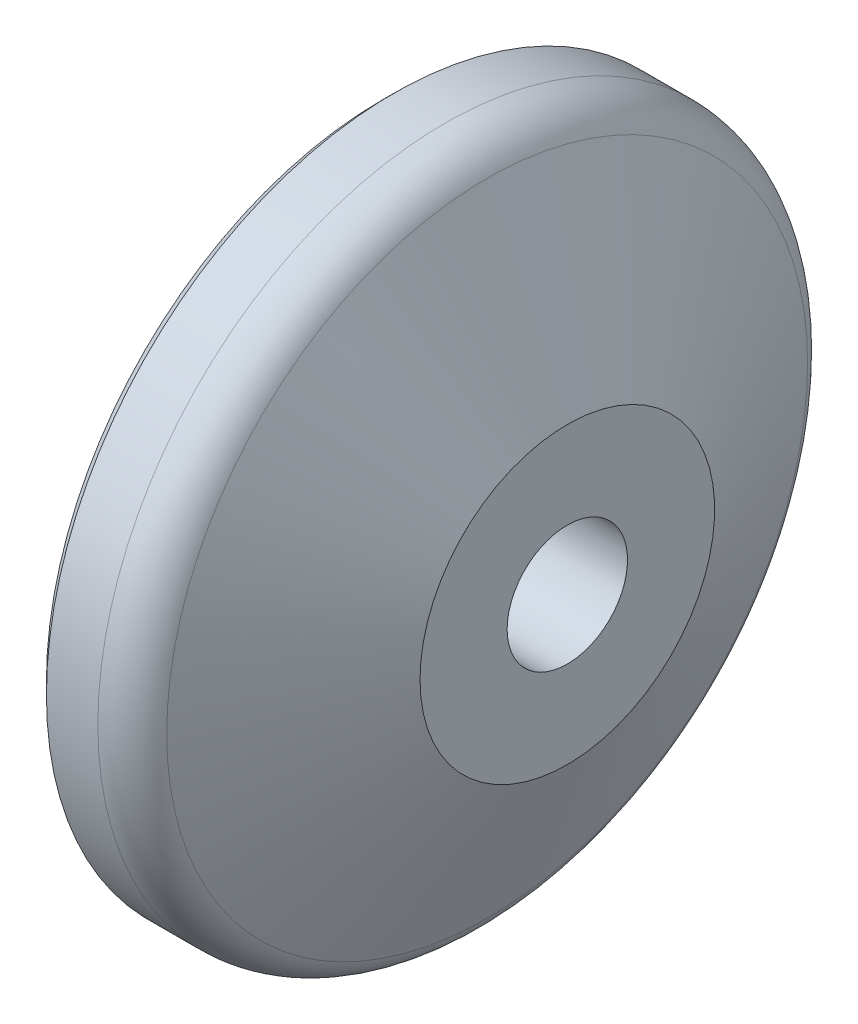
ISO-10303-21;
HEADER;
FILE_DESCRIPTION(('STEP AP214'),'2;1');
FILE_NAME('part.step','',(''),(''),'','','');
FILE_SCHEMA(('AUTOMOTIVE_DESIGN { 1 0 10303 214 1 1 1 1 }'));
ENDSEC;
DATA;
#1=APPLICATION_CONTEXT('core data for automotive mechanical design processes');
#2=APPLICATION_PROTOCOL_DEFINITION('international standard','automotive_design',2000,#1);
#3=PRODUCT_CONTEXT('',#1,'mechanical');
#4=PRODUCT('Part','Part','',(#3));
#5=PRODUCT_RELATED_PRODUCT_CATEGORY('part','',(#4));
#6=PRODUCT_DEFINITION_FORMATION('','',#4);
#7=PRODUCT_DEFINITION_CONTEXT('part definition',#1,'design');
#8=PRODUCT_DEFINITION('design','',#6,#7);
#9=PRODUCT_DEFINITION_SHAPE('','',#8);
#10=(LENGTH_UNIT() NAMED_UNIT(*) SI_UNIT(.MILLI.,.METRE.));
#11=(NAMED_UNIT(*) PLANE_ANGLE_UNIT() SI_UNIT($,.RADIAN.));
#12=(NAMED_UNIT(*) SI_UNIT($,.STERADIAN.) SOLID_ANGLE_UNIT());
#13=UNCERTAINTY_MEASURE_WITH_UNIT(LENGTH_MEASURE(1.E-05),#10,'distance_accuracy_value','');
#14=(GEOMETRIC_REPRESENTATION_CONTEXT(3) GLOBAL_UNCERTAINTY_ASSIGNED_CONTEXT((#13)) GLOBAL_UNIT_ASSIGNED_CONTEXT((#10,
#11,#12)) REPRESENTATION_CONTEXT('',''));
#15=CARTESIAN_POINT('',(0.,0.,0.));
#16=DIRECTION('',(0.,0.,1.));
#17=DIRECTION('',(1.,0.,0.));
#18=AXIS2_PLACEMENT_3D('',#15,#16,#17);
#19=CARTESIAN_POINT('',(0.,0.,0.));
#20=DIRECTION('',(-1.,0.,0.));
#21=DIRECTION('',(0.,0.,1.));
#22=AXIS2_PLACEMENT_3D('',#19,#20,#21);
#23=CYLINDRICAL_SURFACE('',#22,4.);
#24=CARTESIAN_POINT('',(0.500000000000011,0.,0.));
#25=DIRECTION('',(1.,0.,0.));
#26=DIRECTION('',(0.,0.,-1.));
#27=AXIS2_PLACEMENT_3D('',#24,#25,#26);
#28=CIRCLE('',#27,4.);
#29=CARTESIAN_POINT('',(0.500000000000011,0.,-4.));
#30=VERTEX_POINT('',#29);
#31=EDGE_CURVE('E56',#30,#30,#28,.F.);
#32=ORIENTED_EDGE('',*,*,#31,.T.);
#33=EDGE_LOOP('',(#32));
#34=FACE_BOUND('',#33,.T.);
#35=CARTESIAN_POINT('',(4.,0.,0.));
#36=DIRECTION('',(-1.,0.,0.));
#37=DIRECTION('',(0.,0.,1.));
#38=AXIS2_PLACEMENT_3D('',#35,#36,#37);
#39=CIRCLE('',#38,4.);
#40=CARTESIAN_POINT('',(4.,0.,4.));
#41=VERTEX_POINT('',#40);
#42=EDGE_CURVE('E82',#41,#41,#39,.T.);
#43=ORIENTED_EDGE('',*,*,#42,.F.);
#44=EDGE_LOOP('',(#43));
#45=FACE_BOUND('',#44,.T.);
#46=ADVANCED_FACE('F38',(#34,#45),#23,.F.);
#47=CARTESIAN_POINT('',(0.,4.,0.));
#48=DIRECTION('',(1.,0.,0.));
#49=DIRECTION('',(0.,0.,-1.));
#50=AXIS2_PLACEMENT_3D('',#47,#48,#49);
#51=PLANE('',#50);
#52=CARTESIAN_POINT('',(0.,0.,0.));
#53=DIRECTION('',(1.,0.,0.));
#54=DIRECTION('',(0.,0.,-1.));
#55=AXIS2_PLACEMENT_3D('',#52,#53,#54);
#56=CIRCLE('',#55,4.50000000000001);
#57=CARTESIAN_POINT('',(0.,0.,-4.50000000000001));
#58=VERTEX_POINT('',#57);
#59=EDGE_CURVE('E46',#58,#58,#56,.T.);
#60=ORIENTED_EDGE('',*,*,#59,.T.);
#61=EDGE_LOOP('',(#60));
#62=FACE_BOUND('',#61,.T.);
#63=CARTESIAN_POINT('',(0.,0.,0.));
#64=DIRECTION('',(1.,0.,0.));
#65=DIRECTION('',(0.,0.,-1.));
#66=AXIS2_PLACEMENT_3D('',#63,#64,#65);
#67=CIRCLE('',#66,14.5);
#68=CARTESIAN_POINT('',(0.,0.,-14.5));
#69=VERTEX_POINT('',#68);
#70=EDGE_CURVE('E51',#69,#69,#67,.F.);
#71=ORIENTED_EDGE('',*,*,#70,.T.);
#72=EDGE_LOOP('',(#71));
#73=FACE_BOUND('',#72,.T.);
#74=ADVANCED_FACE('F90',(#62,#73),#51,.F.);
#75=CARTESIAN_POINT('',(0.,0.,0.));
#76=DIRECTION('',(-1.,0.,0.));
#77=DIRECTION('',(0.,0.,1.));
#78=AXIS2_PLACEMENT_3D('',#75,#76,#77);
#79=CYLINDRICAL_SURFACE('',#78,15.);
#80=CARTESIAN_POINT('',(0.500000000000007,0.,0.));
#81=DIRECTION('',(1.,0.,0.));
#82=DIRECTION('',(0.,0.,-1.));
#83=AXIS2_PLACEMENT_3D('',#80,#81,#82);
#84=CIRCLE('',#83,15.);
#85=CARTESIAN_POINT('',(0.500000000000007,0.,-15.));
#86=VERTEX_POINT('',#85);
#87=EDGE_CURVE('E10',#86,#86,#84,.T.);
#88=ORIENTED_EDGE('',*,*,#87,.T.);
#89=EDGE_LOOP('',(#88));
#90=FACE_BOUND('',#89,.T.);
#91=CARTESIAN_POINT('',(2.72217058164495,0.,0.));
#92=DIRECTION('',(1.,0.,0.));
#93=DIRECTION('',(0.,0.,-1.));
#94=AXIS2_PLACEMENT_3D('',#91,#92,#93);
#95=CIRCLE('',#94,15.);
#96=CARTESIAN_POINT('',(2.72217058164495,0.,-15.));
#97=VERTEX_POINT('',#96);
#98=EDGE_CURVE('E66',#97,#97,#95,.F.);
#99=ORIENTED_EDGE('',*,*,#98,.T.);
#100=EDGE_LOOP('',(#99));
#101=FACE_BOUND('',#100,.T.);
#102=ADVANCED_FACE('F96',(#90,#101),#79,.T.);
#103=CARTESIAN_POINT('',(8.,0.,0.));
#104=DIRECTION('',(-1.,0.,0.));
#105=DIRECTION('',(0.,0.,1.));
#106=AXIS2_PLACEMENT_3D('',#103,#104,#105);
#107=CONICAL_SURFACE('',#106,6.36292435497637,1.1370857669164);
#108=CARTESIAN_POINT('',(4.5369959250882,0.,0.));
#109=DIRECTION('',(1.,0.,0.));
#110=DIRECTION('',(0.,0.,-1.));
#111=AXIS2_PLACEMENT_3D('',#108,#109,#110);
#112=CIRCLE('',#111,13.8404813934859);
#113=CARTESIAN_POINT('',(4.5369959250882,0.,-13.8404813934859));
#114=VERTEX_POINT('',#113);
#115=EDGE_CURVE('E62',#114,#114,#112,.T.);
#116=ORIENTED_EDGE('',*,*,#115,.T.);
#117=EDGE_LOOP('',(#116));
#118=FACE_BOUND('',#117,.T.);
#119=CARTESIAN_POINT('',(8.,0.,0.));
#120=DIRECTION('',(-1.,0.,0.));
#121=DIRECTION('',(0.,0.,1.));
#122=AXIS2_PLACEMENT_3D('',#119,#120,#121);
#123=CIRCLE('',#122,6.36292435497637);
#124=CARTESIAN_POINT('',(8.,0.,6.36292435497637));
#125=VERTEX_POINT('',#124);
#126=EDGE_CURVE('E70',#125,#125,#123,.T.);
#127=ORIENTED_EDGE('',*,*,#126,.T.);
#128=EDGE_LOOP('',(#127));
#129=FACE_BOUND('',#128,.T.);
#130=ADVANCED_FACE('F132',(#118,#129),#107,.T.);
#131=CARTESIAN_POINT('',(8.,6.36292435497637,0.));
#132=DIRECTION('',(-1.,0.,0.));
#133=DIRECTION('',(0.,0.,1.));
#134=AXIS2_PLACEMENT_3D('',#131,#132,#133);
#135=PLANE('',#134);
#136=ORIENTED_EDGE('',*,*,#126,.F.);
#137=EDGE_LOOP('',(#136));
#138=FACE_BOUND('',#137,.T.);
#139=CARTESIAN_POINT('',(8.,0.,0.));
#140=DIRECTION('',(-1.,0.,0.));
#141=DIRECTION('',(0.,0.,1.));
#142=AXIS2_PLACEMENT_3D('',#139,#140,#141);
#143=CIRCLE('',#142,2.6);
#144=CARTESIAN_POINT('',(8.,0.,2.6));
#145=VERTEX_POINT('',#144);
#146=EDGE_CURVE('E74',#145,#145,#143,.T.);
#147=ORIENTED_EDGE('',*,*,#146,.T.);
#148=EDGE_LOOP('',(#147));
#149=FACE_BOUND('',#148,.T.);
#150=ADVANCED_FACE('F158',(#138,#149),#135,.F.);
#151=CARTESIAN_POINT('',(0.,0.,0.));
#152=DIRECTION('',(-1.,0.,0.));
#153=DIRECTION('',(0.,0.,1.));
#154=AXIS2_PLACEMENT_3D('',#151,#152,#153);
#155=CYLINDRICAL_SURFACE('',#154,2.6);
#156=ORIENTED_EDGE('',*,*,#146,.F.);
#157=EDGE_LOOP('',(#156));
#158=FACE_BOUND('',#157,.T.);
#159=CARTESIAN_POINT('',(4.,0.,0.));
#160=DIRECTION('',(-1.,0.,0.));
#161=DIRECTION('',(0.,0.,1.));
#162=AXIS2_PLACEMENT_3D('',#159,#160,#161);
#163=CIRCLE('',#162,2.6);
#164=CARTESIAN_POINT('',(4.,0.,2.6));
#165=VERTEX_POINT('',#164);
#166=EDGE_CURVE('E78',#165,#165,#163,.T.);
#167=ORIENTED_EDGE('',*,*,#166,.T.);
#168=EDGE_LOOP('',(#167));
#169=FACE_BOUND('',#168,.T.);
#170=ADVANCED_FACE('F167',(#158,#169),#155,.F.);
#171=CARTESIAN_POINT('',(4.,2.6,0.));
#172=DIRECTION('',(1.,0.,0.));
#173=DIRECTION('',(0.,0.,-1.));
#174=AXIS2_PLACEMENT_3D('',#171,#172,#173);
#175=PLANE('',#174);
#176=ORIENTED_EDGE('',*,*,#166,.F.);
#177=EDGE_LOOP('',(#176));
#178=FACE_BOUND('',#177,.T.);
#179=ORIENTED_EDGE('',*,*,#42,.T.);
#180=EDGE_LOOP('',(#179));
#181=FACE_BOUND('',#180,.T.);
#182=ADVANCED_FACE('F87',(#178,#181),#175,.F.);
#183=CARTESIAN_POINT('',(2.72217058164495,0.,0.));
#184=DIRECTION('',(1.,0.,0.));
#185=DIRECTION('',(0.,0.,-1.));
#186=AXIS2_PLACEMENT_3D('',#183,#184,#185);
#187=TOROIDAL_SURFACE('',#186,13.,2.);
#188=ORIENTED_EDGE('',*,*,#115,.F.);
#189=EDGE_LOOP('',(#188));
#190=FACE_BOUND('',#189,.T.);
#191=ORIENTED_EDGE('',*,*,#98,.F.);
#192=EDGE_LOOP('',(#191));
#193=FACE_BOUND('',#192,.T.);
#194=ADVANCED_FACE('F100',(#190,#193),#187,.T.);
#195=CARTESIAN_POINT('',(0.500000000000011,0.,0.));
#196=DIRECTION('',(-1.,0.,0.));
#197=DIRECTION('',(0.,0.,1.));
#198=AXIS2_PLACEMENT_3D('',#195,#196,#197);
#199=CONICAL_SURFACE('',#198,4.,0.785398163397448);
#200=ORIENTED_EDGE('',*,*,#59,.F.);
#201=EDGE_LOOP('',(#200));
#202=FACE_BOUND('',#201,.T.);
#203=ORIENTED_EDGE('',*,*,#31,.F.);
#204=EDGE_LOOP('',(#203));
#205=FACE_BOUND('',#204,.T.);
#206=ADVANCED_FACE('F102',(#202,#205),#199,.F.);
#207=CARTESIAN_POINT('',(0.,0.,0.));
#208=DIRECTION('',(1.,0.,0.));
#209=DIRECTION('',(0.,0.,-1.));
#210=AXIS2_PLACEMENT_3D('',#207,#208,#209);
#211=CONICAL_SURFACE('',#210,14.5,0.78539816339745);
#212=ORIENTED_EDGE('',*,*,#87,.F.);
#213=EDGE_LOOP('',(#212));
#214=FACE_BOUND('',#213,.T.);
#215=ORIENTED_EDGE('',*,*,#70,.F.);
#216=EDGE_LOOP('',(#215));
#217=FACE_BOUND('',#216,.T.);
#218=ADVANCED_FACE('F40',(#214,#217),#211,.T.);
#219=CLOSED_SHELL('',(#46,#74,#102,#130,#150,#170,#182,#194,#206,#218));
#220=MANIFOLD_SOLID_BREP('B2',#219);
#221=ADVANCED_BREP_SHAPE_REPRESENTATION('',(#18,#220),#14);
#222=SHAPE_DEFINITION_REPRESENTATION(#9,#221);
ENDSEC;
END-ISO-10303-21;
